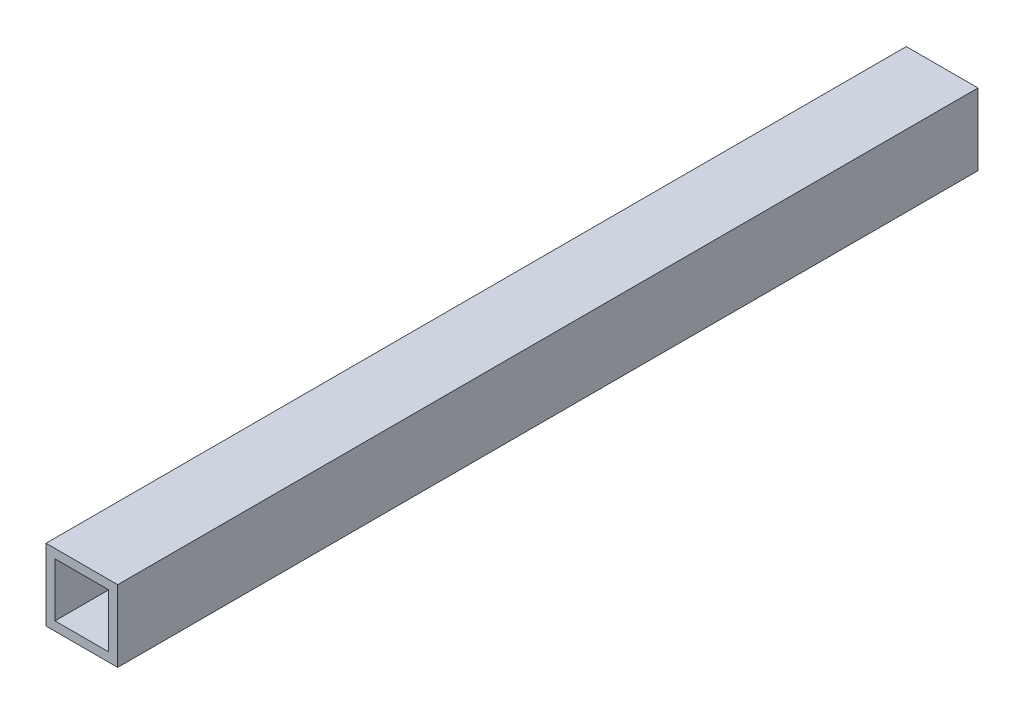
ISO-10303-21;
HEADER;
FILE_DESCRIPTION(('STEP AP214'),'2;1');
FILE_NAME('part.step','',(''),(''),'','','');
FILE_SCHEMA(('AUTOMOTIVE_DESIGN { 1 0 10303 214 1 1 1 1 }'));
ENDSEC;
DATA;
#1=APPLICATION_CONTEXT('core data for automotive mechanical design processes');
#2=APPLICATION_PROTOCOL_DEFINITION('international standard','automotive_design',2000,#1);
#3=PRODUCT_CONTEXT('',#1,'mechanical');
#4=PRODUCT('Part','Part','',(#3));
#5=PRODUCT_RELATED_PRODUCT_CATEGORY('part','',(#4));
#6=PRODUCT_DEFINITION_FORMATION('','',#4);
#7=PRODUCT_DEFINITION_CONTEXT('part definition',#1,'design');
#8=PRODUCT_DEFINITION('design','',#6,#7);
#9=PRODUCT_DEFINITION_SHAPE('','',#8);
#10=(LENGTH_UNIT() NAMED_UNIT(*) SI_UNIT(.MILLI.,.METRE.));
#11=(NAMED_UNIT(*) PLANE_ANGLE_UNIT() SI_UNIT($,.RADIAN.));
#12=(NAMED_UNIT(*) SI_UNIT($,.STERADIAN.) SOLID_ANGLE_UNIT());
#13=UNCERTAINTY_MEASURE_WITH_UNIT(LENGTH_MEASURE(1.E-05),#10,'distance_accuracy_value','');
#14=(GEOMETRIC_REPRESENTATION_CONTEXT(3) GLOBAL_UNCERTAINTY_ASSIGNED_CONTEXT((#13)) GLOBAL_UNIT_ASSIGNED_CONTEXT((#10,
#11,#12)) REPRESENTATION_CONTEXT('',''));
#15=CARTESIAN_POINT('',(0.,0.,0.));
#16=DIRECTION('',(0.,0.,1.));
#17=DIRECTION('',(1.,0.,0.));
#18=AXIS2_PLACEMENT_3D('',#15,#16,#17);
#19=CARTESIAN_POINT('',(0.,0.,609.6));
#20=DIRECTION('',(0.,0.,-1.));
#21=DIRECTION('',(-1.,0.,0.));
#22=AXIS2_PLACEMENT_3D('',#19,#20,#21);
#23=PLANE('',#22);
#24=DIRECTION('',(0.,1.,0.));
#25=VECTOR('',#24,1.);
#26=CARTESIAN_POINT('',(25.4,-25.4,609.6));
#27=LINE('',#26,#25);
#28=CARTESIAN_POINT('',(25.4,-25.4,609.6));
#29=VERTEX_POINT('',#28);
#30=CARTESIAN_POINT('',(25.4,25.4,609.6));
#31=VERTEX_POINT('',#30);
#32=EDGE_CURVE('E134',#29,#31,#27,.T.);
#33=ORIENTED_EDGE('',*,*,#32,.T.);
#34=DIRECTION('',(-1.,0.,0.));
#35=VECTOR('',#34,1.);
#36=CARTESIAN_POINT('',(-25.4,25.4,609.6));
#37=LINE('',#36,#35);
#38=CARTESIAN_POINT('',(-25.4,25.4,609.6));
#39=VERTEX_POINT('',#38);
#40=EDGE_CURVE('E137',#31,#39,#37,.T.);
#41=ORIENTED_EDGE('',*,*,#40,.T.);
#42=DIRECTION('',(0.,-1.,0.));
#43=VECTOR('',#42,1.);
#44=CARTESIAN_POINT('',(-25.4,-25.4,609.6));
#45=LINE('',#44,#43);
#46=CARTESIAN_POINT('',(-25.4,-25.4,609.6));
#47=VERTEX_POINT('',#46);
#48=EDGE_CURVE('E140',#39,#47,#45,.T.);
#49=ORIENTED_EDGE('',*,*,#48,.T.);
#50=DIRECTION('',(1.,0.,0.));
#51=VECTOR('',#50,1.);
#52=CARTESIAN_POINT('',(-25.4,-25.4,609.6));
#53=LINE('',#52,#51);
#54=EDGE_CURVE('E142',#47,#29,#53,.T.);
#55=ORIENTED_EDGE('',*,*,#54,.T.);
#56=EDGE_LOOP('',(#33,#41,#49,#55));
#57=FACE_BOUND('',#56,.T.);
#58=DIRECTION('',(0.,1.,0.));
#59=VECTOR('',#58,1.);
#60=CARTESIAN_POINT('',(19.05,-19.05,609.6));
#61=LINE('',#60,#59);
#62=CARTESIAN_POINT('',(19.05,-19.05,609.6));
#63=VERTEX_POINT('',#62);
#64=CARTESIAN_POINT('',(19.05,19.05,609.6));
#65=VERTEX_POINT('',#64);
#66=EDGE_CURVE('E98',#63,#65,#61,.T.);
#67=ORIENTED_EDGE('',*,*,#66,.F.);
#68=DIRECTION('',(1.,0.,0.));
#69=VECTOR('',#68,1.);
#70=CARTESIAN_POINT('',(-19.05,-19.05,609.6));
#71=LINE('',#70,#69);
#72=CARTESIAN_POINT('',(-19.05,-19.05,609.6));
#73=VERTEX_POINT('',#72);
#74=EDGE_CURVE('E120',#73,#63,#71,.T.);
#75=ORIENTED_EDGE('',*,*,#74,.F.);
#76=DIRECTION('',(0.,-1.,0.));
#77=VECTOR('',#76,1.);
#78=CARTESIAN_POINT('',(-19.05,-19.05,609.6));
#79=LINE('',#78,#77);
#80=CARTESIAN_POINT('',(-19.05,19.05,609.6));
#81=VERTEX_POINT('',#80);
#82=EDGE_CURVE('E118',#81,#73,#79,.T.);
#83=ORIENTED_EDGE('',*,*,#82,.F.);
#84=DIRECTION('',(-1.,0.,0.));
#85=VECTOR('',#84,1.);
#86=CARTESIAN_POINT('',(-19.05,19.05,609.6));
#87=LINE('',#86,#85);
#88=EDGE_CURVE('E106',#65,#81,#87,.T.);
#89=ORIENTED_EDGE('',*,*,#88,.F.);
#90=EDGE_LOOP('',(#67,#75,#83,#89));
#91=FACE_BOUND('',#90,.T.);
#92=ADVANCED_FACE('F33',(#57,#91),#23,.F.);
#93=CARTESIAN_POINT('',(0.,0.,0.));
#94=DIRECTION('',(0.,0.,-1.));
#95=DIRECTION('',(-1.,0.,0.));
#96=AXIS2_PLACEMENT_3D('',#93,#94,#95);
#97=PLANE('',#96);
#98=DIRECTION('',(0.,1.,0.));
#99=VECTOR('',#98,1.);
#100=CARTESIAN_POINT('',(25.4,-25.4,0.));
#101=LINE('',#100,#99);
#102=CARTESIAN_POINT('',(25.4,-25.4,0.));
#103=VERTEX_POINT('',#102);
#104=CARTESIAN_POINT('',(25.4,25.4,0.));
#105=VERTEX_POINT('',#104);
#106=EDGE_CURVE('E114',#103,#105,#101,.T.);
#107=ORIENTED_EDGE('',*,*,#106,.F.);
#108=DIRECTION('',(1.,0.,0.));
#109=VECTOR('',#108,1.);
#110=CARTESIAN_POINT('',(-25.4,-25.4,0.));
#111=LINE('',#110,#109);
#112=CARTESIAN_POINT('',(-25.4,-25.4,0.));
#113=VERTEX_POINT('',#112);
#114=EDGE_CURVE('E138',#113,#103,#111,.T.);
#115=ORIENTED_EDGE('',*,*,#114,.F.);
#116=DIRECTION('',(0.,-1.,0.));
#117=VECTOR('',#116,1.);
#118=CARTESIAN_POINT('',(-25.4,-25.4,0.));
#119=LINE('',#118,#117);
#120=CARTESIAN_POINT('',(-25.4,25.4,0.));
#121=VERTEX_POINT('',#120);
#122=EDGE_CURVE('E149',#121,#113,#119,.T.);
#123=ORIENTED_EDGE('',*,*,#122,.F.);
#124=DIRECTION('',(-1.,0.,0.));
#125=VECTOR('',#124,1.);
#126=CARTESIAN_POINT('',(-25.4,25.4,0.));
#127=LINE('',#126,#125);
#128=EDGE_CURVE('E147',#105,#121,#127,.T.);
#129=ORIENTED_EDGE('',*,*,#128,.F.);
#130=EDGE_LOOP('',(#107,#115,#123,#129));
#131=FACE_BOUND('',#130,.T.);
#132=DIRECTION('',(1.,0.,0.));
#133=VECTOR('',#132,1.);
#134=CARTESIAN_POINT('',(-19.05,-19.05,0.));
#135=LINE('',#134,#133);
#136=CARTESIAN_POINT('',(-19.05,-19.05,0.));
#137=VERTEX_POINT('',#136);
#138=CARTESIAN_POINT('',(19.05,-19.05,0.));
#139=VERTEX_POINT('',#138);
#140=EDGE_CURVE('E107',#137,#139,#135,.T.);
#141=ORIENTED_EDGE('',*,*,#140,.T.);
#142=DIRECTION('',(0.,1.,0.));
#143=VECTOR('',#142,1.);
#144=CARTESIAN_POINT('',(19.05,-19.05,0.));
#145=LINE('',#144,#143);
#146=CARTESIAN_POINT('',(19.05,19.05,0.));
#147=VERTEX_POINT('',#146);
#148=EDGE_CURVE('E56',#139,#147,#145,.T.);
#149=ORIENTED_EDGE('',*,*,#148,.T.);
#150=DIRECTION('',(-1.,0.,0.));
#151=VECTOR('',#150,1.);
#152=CARTESIAN_POINT('',(-19.05,19.05,0.));
#153=LINE('',#152,#151);
#154=CARTESIAN_POINT('',(-19.05,19.05,0.));
#155=VERTEX_POINT('',#154);
#156=EDGE_CURVE('E113',#147,#155,#153,.T.);
#157=ORIENTED_EDGE('',*,*,#156,.T.);
#158=DIRECTION('',(0.,-1.,0.));
#159=VECTOR('',#158,1.);
#160=CARTESIAN_POINT('',(-19.05,-19.05,0.));
#161=LINE('',#160,#159);
#162=EDGE_CURVE('E126',#155,#137,#161,.T.);
#163=ORIENTED_EDGE('',*,*,#162,.T.);
#164=EDGE_LOOP('',(#141,#149,#157,#163));
#165=FACE_BOUND('',#164,.T.);
#166=ADVANCED_FACE('F167',(#131,#165),#97,.T.);
#167=CARTESIAN_POINT('',(25.4,-25.4,609.6));
#168=DIRECTION('',(-1.,0.,0.));
#169=DIRECTION('',(0.,0.,1.));
#170=AXIS2_PLACEMENT_3D('',#167,#168,#169);
#171=PLANE('',#170);
#172=ORIENTED_EDGE('',*,*,#106,.T.);
#173=DIRECTION('',(0.,0.,-1.));
#174=VECTOR('',#173,1.);
#175=CARTESIAN_POINT('',(25.4,25.4,609.6));
#176=LINE('',#175,#174);
#177=EDGE_CURVE('E11',#31,#105,#176,.T.);
#178=ORIENTED_EDGE('',*,*,#177,.F.);
#179=ORIENTED_EDGE('',*,*,#32,.F.);
#180=DIRECTION('',(0.,0.,-1.));
#181=VECTOR('',#180,1.);
#182=CARTESIAN_POINT('',(25.4,-25.4,609.6));
#183=LINE('',#182,#181);
#184=EDGE_CURVE('E144',#29,#103,#183,.T.);
#185=ORIENTED_EDGE('',*,*,#184,.T.);
#186=EDGE_LOOP('',(#172,#178,#179,#185));
#187=FACE_BOUND('',#186,.T.);
#188=ADVANCED_FACE('F35',(#187),#171,.F.);
#189=CARTESIAN_POINT('',(-25.4,25.4,609.6));
#190=DIRECTION('',(0.,-1.,0.));
#191=DIRECTION('',(0.,0.,-1.));
#192=AXIS2_PLACEMENT_3D('',#189,#190,#191);
#193=PLANE('',#192);
#194=ORIENTED_EDGE('',*,*,#128,.T.);
#195=DIRECTION('',(0.,0.,-1.));
#196=VECTOR('',#195,1.);
#197=CARTESIAN_POINT('',(-25.4,25.4,609.6));
#198=LINE('',#197,#196);
#199=EDGE_CURVE('E41',#39,#121,#198,.T.);
#200=ORIENTED_EDGE('',*,*,#199,.F.);
#201=ORIENTED_EDGE('',*,*,#40,.F.);
#202=ORIENTED_EDGE('',*,*,#177,.T.);
#203=EDGE_LOOP('',(#194,#200,#201,#202));
#204=FACE_BOUND('',#203,.T.);
#205=ADVANCED_FACE('F177',(#204),#193,.F.);
#206=CARTESIAN_POINT('',(-25.4,-25.4,609.6));
#207=DIRECTION('',(1.,0.,0.));
#208=DIRECTION('',(0.,0.,-1.));
#209=AXIS2_PLACEMENT_3D('',#206,#207,#208);
#210=PLANE('',#209);
#211=ORIENTED_EDGE('',*,*,#122,.T.);
#212=DIRECTION('',(0.,0.,-1.));
#213=VECTOR('',#212,1.);
#214=CARTESIAN_POINT('',(-25.4,-25.4,609.6));
#215=LINE('',#214,#213);
#216=EDGE_CURVE('E154',#47,#113,#215,.T.);
#217=ORIENTED_EDGE('',*,*,#216,.F.);
#218=ORIENTED_EDGE('',*,*,#48,.F.);
#219=ORIENTED_EDGE('',*,*,#199,.T.);
#220=EDGE_LOOP('',(#211,#217,#218,#219));
#221=FACE_BOUND('',#220,.T.);
#222=ADVANCED_FACE('F161',(#221),#210,.F.);
#223=CARTESIAN_POINT('',(-25.4,-25.4,609.6));
#224=DIRECTION('',(0.,1.,0.));
#225=DIRECTION('',(0.,0.,1.));
#226=AXIS2_PLACEMENT_3D('',#223,#224,#225);
#227=PLANE('',#226);
#228=ORIENTED_EDGE('',*,*,#114,.T.);
#229=ORIENTED_EDGE('',*,*,#184,.F.);
#230=ORIENTED_EDGE('',*,*,#54,.F.);
#231=ORIENTED_EDGE('',*,*,#216,.T.);
#232=EDGE_LOOP('',(#228,#229,#230,#231));
#233=FACE_BOUND('',#232,.T.);
#234=ADVANCED_FACE('F171',(#233),#227,.F.);
#235=CARTESIAN_POINT('',(19.05,-19.05,609.6));
#236=DIRECTION('',(-1.,0.,0.));
#237=DIRECTION('',(0.,0.,1.));
#238=AXIS2_PLACEMENT_3D('',#235,#236,#237);
#239=PLANE('',#238);
#240=ORIENTED_EDGE('',*,*,#148,.F.);
#241=DIRECTION('',(0.,0.,-1.));
#242=VECTOR('',#241,1.);
#243=CARTESIAN_POINT('',(19.05,-19.05,609.6));
#244=LINE('',#243,#242);
#245=EDGE_CURVE('E102',#63,#139,#244,.T.);
#246=ORIENTED_EDGE('',*,*,#245,.F.);
#247=ORIENTED_EDGE('',*,*,#66,.T.);
#248=DIRECTION('',(0.,0.,-1.));
#249=VECTOR('',#248,1.);
#250=CARTESIAN_POINT('',(19.05,19.05,609.6));
#251=LINE('',#250,#249);
#252=EDGE_CURVE('E101',#65,#147,#251,.T.);
#253=ORIENTED_EDGE('',*,*,#252,.T.);
#254=EDGE_LOOP('',(#240,#246,#247,#253));
#255=FACE_BOUND('',#254,.T.);
#256=ADVANCED_FACE('F100',(#255),#239,.T.);
#257=CARTESIAN_POINT('',(-19.05,19.05,609.6));
#258=DIRECTION('',(0.,-1.,0.));
#259=DIRECTION('',(0.,0.,-1.));
#260=AXIS2_PLACEMENT_3D('',#257,#258,#259);
#261=PLANE('',#260);
#262=ORIENTED_EDGE('',*,*,#156,.F.);
#263=ORIENTED_EDGE('',*,*,#252,.F.);
#264=ORIENTED_EDGE('',*,*,#88,.T.);
#265=DIRECTION('',(0.,0.,-1.));
#266=VECTOR('',#265,1.);
#267=CARTESIAN_POINT('',(-19.05,19.05,609.6));
#268=LINE('',#267,#266);
#269=EDGE_CURVE('E115',#81,#155,#268,.T.);
#270=ORIENTED_EDGE('',*,*,#269,.T.);
#271=EDGE_LOOP('',(#262,#263,#264,#270));
#272=FACE_BOUND('',#271,.T.);
#273=ADVANCED_FACE('F110',(#272),#261,.T.);
#274=CARTESIAN_POINT('',(-19.05,-19.05,609.6));
#275=DIRECTION('',(1.,0.,0.));
#276=DIRECTION('',(0.,0.,-1.));
#277=AXIS2_PLACEMENT_3D('',#274,#275,#276);
#278=PLANE('',#277);
#279=ORIENTED_EDGE('',*,*,#162,.F.);
#280=ORIENTED_EDGE('',*,*,#269,.F.);
#281=ORIENTED_EDGE('',*,*,#82,.T.);
#282=DIRECTION('',(0.,0.,-1.));
#283=VECTOR('',#282,1.);
#284=CARTESIAN_POINT('',(-19.05,-19.05,609.6));
#285=LINE('',#284,#283);
#286=EDGE_CURVE('E48',#73,#137,#285,.T.);
#287=ORIENTED_EDGE('',*,*,#286,.T.);
#288=EDGE_LOOP('',(#279,#280,#281,#287));
#289=FACE_BOUND('',#288,.T.);
#290=ADVANCED_FACE('F200',(#289),#278,.T.);
#291=CARTESIAN_POINT('',(-19.05,-19.05,609.6));
#292=DIRECTION('',(0.,1.,0.));
#293=DIRECTION('',(0.,0.,1.));
#294=AXIS2_PLACEMENT_3D('',#291,#292,#293);
#295=PLANE('',#294);
#296=ORIENTED_EDGE('',*,*,#140,.F.);
#297=ORIENTED_EDGE('',*,*,#286,.F.);
#298=ORIENTED_EDGE('',*,*,#74,.T.);
#299=ORIENTED_EDGE('',*,*,#245,.T.);
#300=EDGE_LOOP('',(#296,#297,#298,#299));
#301=FACE_BOUND('',#300,.T.);
#302=ADVANCED_FACE('F204',(#301),#295,.T.);
#303=CLOSED_SHELL('',(#92,#166,#188,#205,#222,#234,#256,#273,#290,#302));
#304=MANIFOLD_SOLID_BREP('B2',#303);
#305=ADVANCED_BREP_SHAPE_REPRESENTATION('',(#18,#304),#14);
#306=SHAPE_DEFINITION_REPRESENTATION(#9,#305);
ENDSEC;
END-ISO-10303-21;
